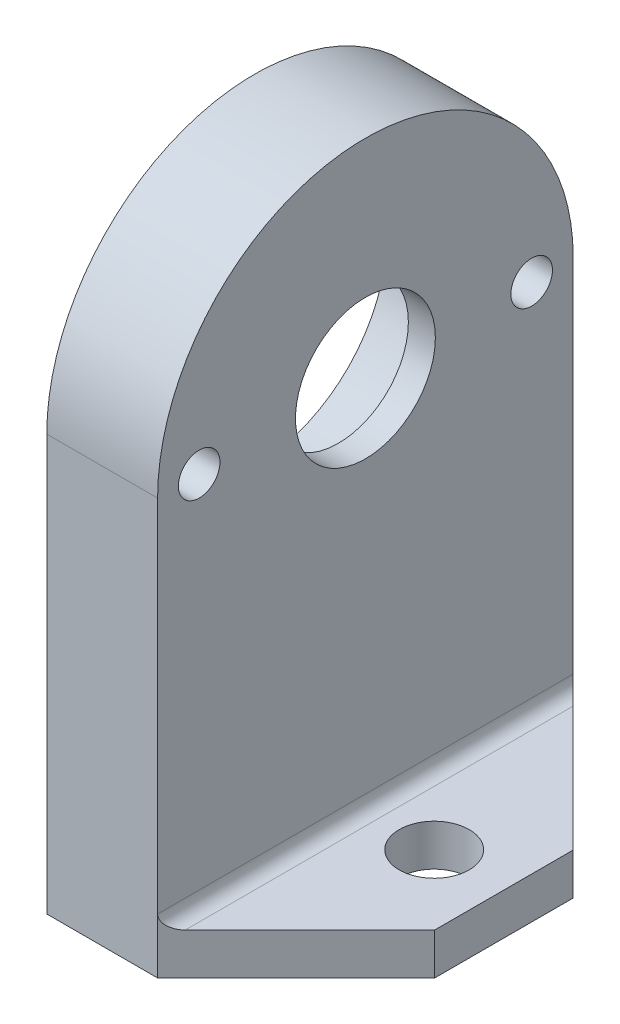
ISO-10303-21;
HEADER;
FILE_DESCRIPTION(('STEP AP214'),'2;1');
FILE_NAME('part.step','',(''),(''),'','','');
FILE_SCHEMA(('AUTOMOTIVE_DESIGN { 1 0 10303 214 1 1 1 1 }'));
ENDSEC;
DATA;
#1=APPLICATION_CONTEXT('core data for automotive mechanical design processes');
#2=APPLICATION_PROTOCOL_DEFINITION('international standard','automotive_design',2000,#1);
#3=PRODUCT_CONTEXT('',#1,'mechanical');
#4=PRODUCT('Part','Part','',(#3));
#5=PRODUCT_RELATED_PRODUCT_CATEGORY('part','',(#4));
#6=PRODUCT_DEFINITION_FORMATION('','',#4);
#7=PRODUCT_DEFINITION_CONTEXT('part definition',#1,'design');
#8=PRODUCT_DEFINITION('design','',#6,#7);
#9=PRODUCT_DEFINITION_SHAPE('','',#8);
#10=(LENGTH_UNIT() NAMED_UNIT(*) SI_UNIT(.MILLI.,.METRE.));
#11=(NAMED_UNIT(*) PLANE_ANGLE_UNIT() SI_UNIT($,.RADIAN.));
#12=(NAMED_UNIT(*) SI_UNIT($,.STERADIAN.) SOLID_ANGLE_UNIT());
#13=UNCERTAINTY_MEASURE_WITH_UNIT(LENGTH_MEASURE(1.E-05),#10,'distance_accuracy_value','');
#14=(GEOMETRIC_REPRESENTATION_CONTEXT(3) GLOBAL_UNCERTAINTY_ASSIGNED_CONTEXT((#13)) GLOBAL_UNIT_ASSIGNED_CONTEXT((#10,
#11,#12)) REPRESENTATION_CONTEXT('',''));
#15=CARTESIAN_POINT('',(0.,0.,0.));
#16=DIRECTION('',(0.,0.,1.));
#17=DIRECTION('',(1.,0.,0.));
#18=AXIS2_PLACEMENT_3D('',#15,#16,#17);
#19=CARTESIAN_POINT('',(4.,0.,0.));
#20=DIRECTION('',(1.,0.,0.));
#21=DIRECTION('',(0.,0.,-1.));
#22=AXIS2_PLACEMENT_3D('',#19,#20,#21);
#23=PLANE('',#22);
#24=CARTESIAN_POINT('',(4.,30.,12.));
#25=DIRECTION('',(1.,0.,0.));
#26=DIRECTION('',(0.,0.,-1.));
#27=AXIS2_PLACEMENT_3D('',#24,#25,#26);
#28=CIRCLE('',#27,1.5);
#29=CARTESIAN_POINT('',(4.,30.,10.5));
#30=VERTEX_POINT('',#29);
#31=EDGE_CURVE('E150',#30,#30,#28,.T.);
#32=ORIENTED_EDGE('',*,*,#31,.F.);
#33=EDGE_LOOP('',(#32));
#34=FACE_BOUND('',#33,.T.);
#35=CARTESIAN_POINT('',(4.,30.,-12.));
#36=DIRECTION('',(1.,0.,0.));
#37=DIRECTION('',(0.,0.,-1.));
#38=AXIS2_PLACEMENT_3D('',#35,#36,#37);
#39=CIRCLE('',#38,1.5);
#40=CARTESIAN_POINT('',(4.,30.,-13.5));
#41=VERTEX_POINT('',#40);
#42=EDGE_CURVE('E146',#41,#41,#39,.T.);
#43=ORIENTED_EDGE('',*,*,#42,.F.);
#44=EDGE_LOOP('',(#43));
#45=FACE_BOUND('',#44,.T.);
#46=CARTESIAN_POINT('',(4.,30.,0.));
#47=DIRECTION('',(1.,0.,0.));
#48=DIRECTION('',(0.,0.,-1.));
#49=AXIS2_PLACEMENT_3D('',#46,#47,#48);
#50=CIRCLE('',#49,5.05);
#51=CARTESIAN_POINT('',(4.,30.,-5.05));
#52=VERTEX_POINT('',#51);
#53=EDGE_CURVE('E244',#52,#52,#50,.T.);
#54=ORIENTED_EDGE('',*,*,#53,.F.);
#55=EDGE_LOOP('',(#54));
#56=FACE_BOUND('',#55,.T.);
#57=DIRECTION('',(0.,1.,0.));
#58=VECTOR('',#57,1.);
#59=CARTESIAN_POINT('',(4.,0.,15.));
#60=LINE('',#59,#58);
#61=CARTESIAN_POINT('',(4.,4.,15.));
#62=VERTEX_POINT('',#61);
#63=CARTESIAN_POINT('',(4.,30.,15.));
#64=VERTEX_POINT('',#63);
#65=EDGE_CURVE('E121',#62,#64,#60,.T.);
#66=ORIENTED_EDGE('',*,*,#65,.F.);
#67=DIRECTION('',(0.,0.,-1.));
#68=VECTOR('',#67,1.);
#69=CARTESIAN_POINT('',(4.,4.,0.));
#70=LINE('',#69,#68);
#71=CARTESIAN_POINT('',(4.00000000000001,4.,-15.));
#72=VERTEX_POINT('',#71);
#73=EDGE_CURVE('E218',#62,#72,#70,.T.);
#74=ORIENTED_EDGE('',*,*,#73,.T.);
#75=DIRECTION('',(0.,-1.,0.));
#76=VECTOR('',#75,1.);
#77=CARTESIAN_POINT('',(4.,0.,-15.));
#78=LINE('',#77,#76);
#79=CARTESIAN_POINT('',(4.,30.,-15.));
#80=VERTEX_POINT('',#79);
#81=EDGE_CURVE('E131',#80,#72,#78,.T.);
#82=ORIENTED_EDGE('',*,*,#81,.F.);
#83=CARTESIAN_POINT('',(4.,30.,0.));
#84=DIRECTION('',(1.,0.,0.));
#85=DIRECTION('',(0.,0.,-1.));
#86=AXIS2_PLACEMENT_3D('',#83,#84,#85);
#87=CIRCLE('',#86,15.);
#88=EDGE_CURVE('E132',#64,#80,#87,.F.);
#89=ORIENTED_EDGE('',*,*,#88,.F.);
#90=EDGE_LOOP('',(#66,#74,#82,#89));
#91=FACE_BOUND('',#90,.T.);
#92=ADVANCED_FACE('F49',(#34,#45,#56,#91),#23,.T.);
#93=CARTESIAN_POINT('',(4.,30.,0.));
#94=DIRECTION('',(-1.,0.,0.));
#95=DIRECTION('',(0.,0.,1.));
#96=AXIS2_PLACEMENT_3D('',#93,#94,#95);
#97=CYLINDRICAL_SURFACE('',#96,9.525);
#98=CARTESIAN_POINT('',(-4.,30.,0.));
#99=DIRECTION('',(1.,0.,0.));
#100=DIRECTION('',(0.,0.,-1.));
#101=AXIS2_PLACEMENT_3D('',#98,#99,#100);
#102=CIRCLE('',#101,9.525);
#103=CARTESIAN_POINT('',(-4.,30.,-9.525));
#104=VERTEX_POINT('',#103);
#105=EDGE_CURVE('E166',#104,#104,#102,.T.);
#106=ORIENTED_EDGE('',*,*,#105,.F.);
#107=EDGE_LOOP('',(#106));
#108=FACE_BOUND('',#107,.T.);
#109=CARTESIAN_POINT('',(2.05,30.,0.));
#110=DIRECTION('',(1.,0.,0.));
#111=DIRECTION('',(0.,0.,-1.));
#112=AXIS2_PLACEMENT_3D('',#109,#110,#111);
#113=CIRCLE('',#112,9.525);
#114=CARTESIAN_POINT('',(2.05,30.,-9.525));
#115=VERTEX_POINT('',#114);
#116=EDGE_CURVE('E162',#115,#115,#113,.T.);
#117=ORIENTED_EDGE('',*,*,#116,.T.);
#118=EDGE_LOOP('',(#117));
#119=FACE_BOUND('',#118,.T.);
#120=ADVANCED_FACE('F266',(#108,#119),#97,.F.);
#121=CARTESIAN_POINT('',(4.,30.,0.));
#122=DIRECTION('',(-1.,0.,0.));
#123=DIRECTION('',(0.,0.,1.));
#124=AXIS2_PLACEMENT_3D('',#121,#122,#123);
#125=CYLINDRICAL_SURFACE('',#124,15.);
#126=CARTESIAN_POINT('',(-4.,30.,0.));
#127=DIRECTION('',(1.,0.,0.));
#128=DIRECTION('',(0.,0.,-1.));
#129=AXIS2_PLACEMENT_3D('',#126,#127,#128);
#130=CIRCLE('',#129,15.);
#131=CARTESIAN_POINT('',(-4.,30.,15.));
#132=VERTEX_POINT('',#131);
#133=CARTESIAN_POINT('',(-4.,30.,-15.));
#134=VERTEX_POINT('',#133);
#135=EDGE_CURVE('E139',#132,#134,#130,.F.);
#136=ORIENTED_EDGE('',*,*,#135,.F.);
#137=DIRECTION('',(-1.,0.,0.));
#138=VECTOR('',#137,1.);
#139=CARTESIAN_POINT('',(4.,30.,15.));
#140=LINE('',#139,#138);
#141=EDGE_CURVE('E125',#64,#132,#140,.T.);
#142=ORIENTED_EDGE('',*,*,#141,.F.);
#143=ORIENTED_EDGE('',*,*,#88,.T.);
#144=DIRECTION('',(-1.,0.,0.));
#145=VECTOR('',#144,1.);
#146=CARTESIAN_POINT('',(4.,30.,-15.));
#147=LINE('',#146,#145);
#148=EDGE_CURVE('E156',#80,#134,#147,.T.);
#149=ORIENTED_EDGE('',*,*,#148,.T.);
#150=EDGE_LOOP('',(#136,#142,#143,#149));
#151=FACE_BOUND('',#150,.T.);
#152=ADVANCED_FACE('F136',(#151),#125,.T.);
#153=CARTESIAN_POINT('',(4.,0.,15.));
#154=DIRECTION('',(0.,0.,1.));
#155=DIRECTION('',(1.,0.,0.));
#156=AXIS2_PLACEMENT_3D('',#153,#154,#155);
#157=PLANE('',#156);
#158=DIRECTION('',(-1.,0.,0.));
#159=VECTOR('',#158,1.);
#160=CARTESIAN_POINT('',(4.,0.,15.));
#161=LINE('',#160,#159);
#162=CARTESIAN_POINT('',(3.99999999999996,0.,15.));
#163=VERTEX_POINT('',#162);
#164=CARTESIAN_POINT('',(-4.,0.,15.));
#165=VERTEX_POINT('',#164);
#166=EDGE_CURVE('E142',#163,#165,#161,.T.);
#167=ORIENTED_EDGE('',*,*,#166,.F.);
#168=DIRECTION('',(0.,1.,0.));
#169=VECTOR('',#168,1.);
#170=CARTESIAN_POINT('',(3.99999999999996,0.,15.));
#171=LINE('',#170,#169);
#172=EDGE_CURVE('E65',#163,#62,#171,.T.);
#173=ORIENTED_EDGE('',*,*,#172,.T.);
#174=ORIENTED_EDGE('',*,*,#65,.T.);
#175=ORIENTED_EDGE('',*,*,#141,.T.);
#176=DIRECTION('',(0.,1.,0.));
#177=VECTOR('',#176,1.);
#178=CARTESIAN_POINT('',(-4.,0.,15.));
#179=LINE('',#178,#177);
#180=EDGE_CURVE('E172',#165,#132,#179,.T.);
#181=ORIENTED_EDGE('',*,*,#180,.F.);
#182=EDGE_LOOP('',(#167,#173,#174,#175,#181));
#183=FACE_BOUND('',#182,.T.);
#184=ADVANCED_FACE('F123',(#183),#157,.T.);
#185=CARTESIAN_POINT('',(4.,0.,0.));
#186=DIRECTION('',(0.,-1.,0.));
#187=DIRECTION('',(0.,0.,-1.));
#188=AXIS2_PLACEMENT_3D('',#185,#186,#187);
#189=PLANE('',#188);
#190=CARTESIAN_POINT('',(8.96418123319642,0.,0.));
#191=DIRECTION('',(0.,-1.,0.));
#192=DIRECTION('',(0.,0.,-1.));
#193=AXIS2_PLACEMENT_3D('',#190,#191,#192);
#194=CIRCLE('',#193,2.52499999999999);
#195=CARTESIAN_POINT('',(8.96418123319642,0.,-2.525));
#196=VERTEX_POINT('',#195);
#197=EDGE_CURVE('E195',#196,#196,#194,.T.);
#198=ORIENTED_EDGE('',*,*,#197,.F.);
#199=EDGE_LOOP('',(#198));
#200=FACE_BOUND('',#199,.T.);
#201=DIRECTION('',(-1.,0.,0.));
#202=VECTOR('',#201,1.);
#203=CARTESIAN_POINT('',(4.,0.,-15.));
#204=LINE('',#203,#202);
#205=CARTESIAN_POINT('',(4.00000000000001,0.,-15.));
#206=VERTEX_POINT('',#205);
#207=CARTESIAN_POINT('',(-4.,0.,-15.));
#208=VERTEX_POINT('',#207);
#209=EDGE_CURVE('E185',#206,#208,#204,.T.);
#210=ORIENTED_EDGE('',*,*,#209,.F.);
#211=DIRECTION('',(-0.707106781186546,0.,-0.707106781186549));
#212=VECTOR('',#211,1.);
#213=CARTESIAN_POINT('',(11.5,0.,-7.49999999999997));
#214=LINE('',#213,#212);
#215=CARTESIAN_POINT('',(14.,0.,-4.99999999999995));
#216=VERTEX_POINT('',#215);
#217=EDGE_CURVE('E201',#206,#216,#214,.F.);
#218=ORIENTED_EDGE('',*,*,#217,.T.);
#219=DIRECTION('',(0.,0.,1.));
#220=VECTOR('',#219,1.);
#221=CARTESIAN_POINT('',(14.,0.,15.));
#222=LINE('',#221,#220);
#223=CARTESIAN_POINT('',(14.,0.,5.00000000000001));
#224=VERTEX_POINT('',#223);
#225=EDGE_CURVE('E194',#216,#224,#222,.T.);
#226=ORIENTED_EDGE('',*,*,#225,.T.);
#227=DIRECTION('',(0.707106781186549,0.,-0.707106781186546));
#228=VECTOR('',#227,1.);
#229=CARTESIAN_POINT('',(11.5,0.,7.50000000000002));
#230=LINE('',#229,#228);
#231=EDGE_CURVE('E198',#224,#163,#230,.F.);
#232=ORIENTED_EDGE('',*,*,#231,.T.);
#233=ORIENTED_EDGE('',*,*,#166,.T.);
#234=DIRECTION('',(0.,0.,1.));
#235=VECTOR('',#234,1.);
#236=CARTESIAN_POINT('',(-4.,0.,0.));
#237=LINE('',#236,#235);
#238=EDGE_CURVE('E175',#208,#165,#237,.T.);
#239=ORIENTED_EDGE('',*,*,#238,.F.);
#240=EDGE_LOOP('',(#210,#218,#226,#232,#233,#239));
#241=FACE_BOUND('',#240,.T.);
#242=ADVANCED_FACE('F240',(#200,#241),#189,.T.);
#243=CARTESIAN_POINT('',(4.,30.,-12.));
#244=DIRECTION('',(-1.,0.,0.));
#245=DIRECTION('',(0.,0.,1.));
#246=AXIS2_PLACEMENT_3D('',#243,#244,#245);
#247=CYLINDRICAL_SURFACE('',#246,1.5);
#248=ORIENTED_EDGE('',*,*,#42,.T.);
#249=EDGE_LOOP('',(#248));
#250=FACE_BOUND('',#249,.T.);
#251=CARTESIAN_POINT('',(-4.,30.,-12.));
#252=DIRECTION('',(1.,0.,0.));
#253=DIRECTION('',(0.,0.,-1.));
#254=AXIS2_PLACEMENT_3D('',#251,#252,#253);
#255=CIRCLE('',#254,1.5);
#256=CARTESIAN_POINT('',(-4.,30.,-13.5));
#257=VERTEX_POINT('',#256);
#258=EDGE_CURVE('E161',#257,#257,#255,.T.);
#259=ORIENTED_EDGE('',*,*,#258,.F.);
#260=EDGE_LOOP('',(#259));
#261=FACE_BOUND('',#260,.T.);
#262=ADVANCED_FACE('F297',(#250,#261),#247,.F.);
#263=CARTESIAN_POINT('',(4.,30.,12.));
#264=DIRECTION('',(-1.,0.,0.));
#265=DIRECTION('',(0.,0.,1.));
#266=AXIS2_PLACEMENT_3D('',#263,#264,#265);
#267=CYLINDRICAL_SURFACE('',#266,1.5);
#268=ORIENTED_EDGE('',*,*,#31,.T.);
#269=EDGE_LOOP('',(#268));
#270=FACE_BOUND('',#269,.T.);
#271=CARTESIAN_POINT('',(-4.,30.,12.));
#272=DIRECTION('',(1.,0.,0.));
#273=DIRECTION('',(0.,0.,-1.));
#274=AXIS2_PLACEMENT_3D('',#271,#272,#273);
#275=CIRCLE('',#274,1.5);
#276=CARTESIAN_POINT('',(-4.,30.,10.5));
#277=VERTEX_POINT('',#276);
#278=EDGE_CURVE('E157',#277,#277,#275,.T.);
#279=ORIENTED_EDGE('',*,*,#278,.F.);
#280=EDGE_LOOP('',(#279));
#281=FACE_BOUND('',#280,.T.);
#282=ADVANCED_FACE('F261',(#270,#281),#267,.F.);
#283=CARTESIAN_POINT('',(4.,0.,-15.));
#284=DIRECTION('',(0.,0.,-1.));
#285=DIRECTION('',(0.,1.,0.));
#286=AXIS2_PLACEMENT_3D('',#283,#284,#285);
#287=PLANE('',#286);
#288=ORIENTED_EDGE('',*,*,#81,.T.);
#289=DIRECTION('',(0.,-1.,0.));
#290=VECTOR('',#289,1.);
#291=CARTESIAN_POINT('',(4.00000000000001,0.,-15.));
#292=LINE('',#291,#290);
#293=EDGE_CURVE('E85',#72,#206,#292,.T.);
#294=ORIENTED_EDGE('',*,*,#293,.T.);
#295=ORIENTED_EDGE('',*,*,#209,.T.);
#296=DIRECTION('',(0.,-1.,0.));
#297=VECTOR('',#296,1.);
#298=CARTESIAN_POINT('',(-4.,0.,-15.));
#299=LINE('',#298,#297);
#300=EDGE_CURVE('E179',#134,#208,#299,.T.);
#301=ORIENTED_EDGE('',*,*,#300,.F.);
#302=ORIENTED_EDGE('',*,*,#148,.F.);
#303=EDGE_LOOP('',(#288,#294,#295,#301,#302));
#304=FACE_BOUND('',#303,.T.);
#305=ADVANCED_FACE('F290',(#304),#287,.T.);
#306=CARTESIAN_POINT('',(-4.,0.,0.));
#307=DIRECTION('',(1.,0.,0.));
#308=DIRECTION('',(0.,0.,-1.));
#309=AXIS2_PLACEMENT_3D('',#306,#307,#308);
#310=PLANE('',#309);
#311=ORIENTED_EDGE('',*,*,#278,.T.);
#312=EDGE_LOOP('',(#311));
#313=FACE_BOUND('',#312,.T.);
#314=ORIENTED_EDGE('',*,*,#258,.T.);
#315=EDGE_LOOP('',(#314));
#316=FACE_BOUND('',#315,.T.);
#317=ORIENTED_EDGE('',*,*,#105,.T.);
#318=EDGE_LOOP('',(#317));
#319=FACE_BOUND('',#318,.T.);
#320=ORIENTED_EDGE('',*,*,#135,.T.);
#321=ORIENTED_EDGE('',*,*,#300,.T.);
#322=ORIENTED_EDGE('',*,*,#238,.T.);
#323=ORIENTED_EDGE('',*,*,#180,.T.);
#324=EDGE_LOOP('',(#320,#321,#322,#323));
#325=FACE_BOUND('',#324,.T.);
#326=ADVANCED_FACE('F282',(#313,#316,#319,#325),#310,.F.);
#327=CARTESIAN_POINT('',(2.05,30.,0.));
#328=DIRECTION('',(1.,0.,0.));
#329=DIRECTION('',(0.,0.,-1.));
#330=AXIS2_PLACEMENT_3D('',#327,#328,#329);
#331=PLANE('',#330);
#332=CARTESIAN_POINT('',(2.05,30.,0.));
#333=DIRECTION('',(1.,0.,0.));
#334=DIRECTION('',(0.,0.,-1.));
#335=AXIS2_PLACEMENT_3D('',#332,#333,#334);
#336=CIRCLE('',#335,5.05);
#337=CARTESIAN_POINT('',(2.05,30.,-5.05));
#338=VERTEX_POINT('',#337);
#339=EDGE_CURVE('E248',#338,#338,#336,.T.);
#340=ORIENTED_EDGE('',*,*,#339,.T.);
#341=EDGE_LOOP('',(#340));
#342=FACE_BOUND('',#341,.T.);
#343=ORIENTED_EDGE('',*,*,#116,.F.);
#344=EDGE_LOOP('',(#343));
#345=FACE_BOUND('',#344,.T.);
#346=ADVANCED_FACE('F274',(#342,#345),#331,.F.);
#347=CARTESIAN_POINT('',(2.05,30.,0.));
#348=DIRECTION('',(1.,0.,0.));
#349=DIRECTION('',(0.,0.,-1.));
#350=AXIS2_PLACEMENT_3D('',#347,#348,#349);
#351=CYLINDRICAL_SURFACE('',#350,5.05);
#352=ORIENTED_EDGE('',*,*,#339,.F.);
#353=EDGE_LOOP('',(#352));
#354=FACE_BOUND('',#353,.T.);
#355=ORIENTED_EDGE('',*,*,#53,.T.);
#356=EDGE_LOOP('',(#355));
#357=FACE_BOUND('',#356,.T.);
#358=ADVANCED_FACE('F272',(#354,#357),#351,.F.);
#359=CARTESIAN_POINT('',(14.,3.,15.));
#360=DIRECTION('',(1.,0.,0.));
#361=DIRECTION('',(0.,0.,-1.));
#362=AXIS2_PLACEMENT_3D('',#359,#360,#361);
#363=PLANE('',#362);
#364=ORIENTED_EDGE('',*,*,#225,.F.);
#365=DIRECTION('',(0.,1.,0.));
#366=VECTOR('',#365,1.);
#367=CARTESIAN_POINT('',(14.,3.,-4.99999999999996));
#368=LINE('',#367,#366);
#369=CARTESIAN_POINT('',(14.,3.,-4.99999999999995));
#370=VERTEX_POINT('',#369);
#371=EDGE_CURVE('E208',#216,#370,#368,.T.);
#372=ORIENTED_EDGE('',*,*,#371,.T.);
#373=DIRECTION('',(0.,0.,1.));
#374=VECTOR('',#373,1.);
#375=CARTESIAN_POINT('',(14.,3.,15.));
#376=LINE('',#375,#374);
#377=CARTESIAN_POINT('',(14.,3.,5.00000000000001));
#378=VERTEX_POINT('',#377);
#379=EDGE_CURVE('E229',#370,#378,#376,.T.);
#380=ORIENTED_EDGE('',*,*,#379,.T.);
#381=DIRECTION('',(0.,-1.,0.));
#382=VECTOR('',#381,1.);
#383=CARTESIAN_POINT('',(14.,3.,5.00000000000001));
#384=LINE('',#383,#382);
#385=EDGE_CURVE('E204',#378,#224,#384,.T.);
#386=ORIENTED_EDGE('',*,*,#385,.T.);
#387=EDGE_LOOP('',(#364,#372,#380,#386));
#388=FACE_BOUND('',#387,.T.);
#389=ADVANCED_FACE('F237',(#388),#363,.T.);
#390=CARTESIAN_POINT('',(0.,3.,0.));
#391=DIRECTION('',(0.,-1.,0.));
#392=DIRECTION('',(0.,0.,-1.));
#393=AXIS2_PLACEMENT_3D('',#390,#391,#392);
#394=PLANE('',#393);
#395=CARTESIAN_POINT('',(8.96418123319642,3.,0.));
#396=DIRECTION('',(0.,-1.,0.));
#397=DIRECTION('',(0.,0.,-1.));
#398=AXIS2_PLACEMENT_3D('',#395,#396,#397);
#399=CIRCLE('',#398,2.52499999999999);
#400=CARTESIAN_POINT('',(8.96418123319642,3.00000000000001,-2.525));
#401=VERTEX_POINT('',#400);
#402=EDGE_CURVE('E190',#401,#401,#399,.T.);
#403=ORIENTED_EDGE('',*,*,#402,.T.);
#404=EDGE_LOOP('',(#403));
#405=FACE_BOUND('',#404,.T.);
#406=DIRECTION('',(0.707106781186546,0.,0.707106781186549));
#407=VECTOR('',#406,1.);
#408=CARTESIAN_POINT('',(4.00000000000001,3.,-15.));
#409=LINE('',#408,#407);
#410=CARTESIAN_POINT('',(5.,3.,-14.));
#411=VERTEX_POINT('',#410);
#412=EDGE_CURVE('E213',#370,#411,#409,.F.);
#413=ORIENTED_EDGE('',*,*,#412,.T.);
#414=DIRECTION('',(0.,0.,-1.));
#415=VECTOR('',#414,1.);
#416=CARTESIAN_POINT('',(5.,3.,0.));
#417=LINE('',#416,#415);
#418=CARTESIAN_POINT('',(5.,3.,14.));
#419=VERTEX_POINT('',#418);
#420=EDGE_CURVE('E74',#411,#419,#417,.F.);
#421=ORIENTED_EDGE('',*,*,#420,.T.);
#422=DIRECTION('',(-0.707106781186549,0.,0.707106781186546));
#423=VECTOR('',#422,1.);
#424=CARTESIAN_POINT('',(14.,3.,5.00000000000001));
#425=LINE('',#424,#423);
#426=EDGE_CURVE('E89',#419,#378,#425,.F.);
#427=ORIENTED_EDGE('',*,*,#426,.T.);
#428=ORIENTED_EDGE('',*,*,#379,.F.);
#429=EDGE_LOOP('',(#413,#421,#427,#428));
#430=FACE_BOUND('',#429,.T.);
#431=ADVANCED_FACE('F228',(#405,#430),#394,.F.);
#432=CARTESIAN_POINT('',(8.96418123319642,45.,0.));
#433=DIRECTION('',(0.,-1.,0.));
#434=DIRECTION('',(0.,0.,-1.));
#435=AXIS2_PLACEMENT_3D('',#432,#433,#434);
#436=CYLINDRICAL_SURFACE('',#435,2.52499999999999);
#437=CARTESIAN_POINT('',(8.96418123319642,0.,-2.525));
#438=CARTESIAN_POINT('',(8.96418123319642,0.0312500000000081,-2.525));
#439=CARTESIAN_POINT('',(8.96418123319642,0.0625000000000093,-2.525));
#440=CARTESIAN_POINT('',(8.96418123319642,0.125000000000009,-2.525));
#441=CARTESIAN_POINT('',(8.96418123319642,0.156250000000008,-2.525));
#442=CARTESIAN_POINT('',(8.96418123319642,0.218750000000006,-2.525));
#443=CARTESIAN_POINT('',(8.96418123319642,0.250000000000005,-2.525));
#444=CARTESIAN_POINT('',(8.96418123319642,0.312500000000005,-2.525));
#445=CARTESIAN_POINT('',(8.96418123319642,0.343750000000006,-2.525));
#446=CARTESIAN_POINT('',(8.96418123319642,0.406250000000008,-2.525));
#447=CARTESIAN_POINT('',(8.96418123319642,0.43750000000001,-2.525));
#448=CARTESIAN_POINT('',(8.96418123319642,0.50000000000001,-2.525));
#449=CARTESIAN_POINT('',(8.96418123319642,0.531250000000009,-2.525));
#450=CARTESIAN_POINT('',(8.96418123319642,0.593750000000006,-2.525));
#451=CARTESIAN_POINT('',(8.96418123319642,0.625000000000005,-2.525));
#452=CARTESIAN_POINT('',(8.96418123319642,0.687500000000005,-2.525));
#453=CARTESIAN_POINT('',(8.96418123319642,0.718750000000006,-2.525));
#454=CARTESIAN_POINT('',(8.96418123319642,0.781250000000009,-2.525));
#455=CARTESIAN_POINT('',(8.96418123319642,0.81250000000001,-2.525));
#456=CARTESIAN_POINT('',(8.96418123319642,0.87500000000001,-2.525));
#457=CARTESIAN_POINT('',(8.96418123319642,0.906250000000009,-2.525));
#458=CARTESIAN_POINT('',(8.96418123319642,0.968750000000007,-2.525));
#459=CARTESIAN_POINT('',(8.96418123319642,1.00000000000001,-2.525));
#460=CARTESIAN_POINT('',(8.96418123319642,1.06250000000001,-2.525));
#461=CARTESIAN_POINT('',(8.96418123319642,1.09375000000001,-2.525));
#462=CARTESIAN_POINT('',(8.96418123319642,1.15625000000001,-2.525));
#463=CARTESIAN_POINT('',(8.96418123319642,1.18750000000001,-2.525));
#464=CARTESIAN_POINT('',(8.96418123319642,1.25000000000001,-2.525));
#465=CARTESIAN_POINT('',(8.96418123319642,1.28125000000001,-2.525));
#466=CARTESIAN_POINT('',(8.96418123319642,1.34375000000001,-2.525));
#467=CARTESIAN_POINT('',(8.96418123319642,1.37500000000001,-2.525));
#468=CARTESIAN_POINT('',(8.96418123319642,1.43750000000001,-2.525));
#469=CARTESIAN_POINT('',(8.96418123319642,1.46875000000001,-2.525));
#470=CARTESIAN_POINT('',(8.96418123319642,1.53125000000001,-2.525));
#471=CARTESIAN_POINT('',(8.96418123319642,1.56250000000001,-2.525));
#472=CARTESIAN_POINT('',(8.96418123319642,1.62500000000001,-2.525));
#473=CARTESIAN_POINT('',(8.96418123319642,1.65625000000001,-2.525));
#474=CARTESIAN_POINT('',(8.96418123319642,1.71875000000001,-2.525));
#475=CARTESIAN_POINT('',(8.96418123319642,1.75000000000001,-2.525));
#476=CARTESIAN_POINT('',(8.96418123319642,1.81250000000001,-2.525));
#477=CARTESIAN_POINT('',(8.96418123319642,1.84375000000001,-2.525));
#478=CARTESIAN_POINT('',(8.96418123319642,1.90625000000001,-2.525));
#479=CARTESIAN_POINT('',(8.96418123319642,1.93750000000001,-2.525));
#480=CARTESIAN_POINT('',(8.96418123319642,2.00000000000001,-2.525));
#481=CARTESIAN_POINT('',(8.96418123319642,2.03125000000001,-2.525));
#482=CARTESIAN_POINT('',(8.96418123319642,2.09375000000001,-2.525));
#483=CARTESIAN_POINT('',(8.96418123319642,2.12500000000001,-2.525));
#484=CARTESIAN_POINT('',(8.96418123319642,2.18750000000001,-2.525));
#485=CARTESIAN_POINT('',(8.96418123319642,2.21875000000001,-2.525));
#486=CARTESIAN_POINT('',(8.96418123319642,2.28125000000001,-2.525));
#487=CARTESIAN_POINT('',(8.96418123319642,2.31250000000001,-2.525));
#488=CARTESIAN_POINT('',(8.96418123319642,2.37500000000001,-2.525));
#489=CARTESIAN_POINT('',(8.96418123319642,2.40625000000001,-2.525));
#490=CARTESIAN_POINT('',(8.96418123319642,2.46875000000001,-2.525));
#491=CARTESIAN_POINT('',(8.96418123319642,2.50000000000001,-2.525));
#492=CARTESIAN_POINT('',(8.96418123319642,2.56250000000001,-2.525));
#493=CARTESIAN_POINT('',(8.96418123319642,2.59375000000001,-2.525));
#494=CARTESIAN_POINT('',(8.96418123319642,2.65625000000001,-2.525));
#495=CARTESIAN_POINT('',(8.96418123319642,2.68750000000001,-2.525));
#496=CARTESIAN_POINT('',(8.96418123319642,2.75000000000001,-2.525));
#497=CARTESIAN_POINT('',(8.96418123319642,2.78125000000001,-2.525));
#498=CARTESIAN_POINT('',(8.96418123319642,2.84375000000001,-2.525));
#499=CARTESIAN_POINT('',(8.96418123319642,2.87500000000001,-2.525));
#500=CARTESIAN_POINT('',(8.96418123319642,2.93750000000001,-2.525));
#501=CARTESIAN_POINT('',(8.96418123319642,2.96875000000001,-2.525));
#502=CARTESIAN_POINT('',(8.96418123319642,3.00000000000001,-2.525));
#503=B_SPLINE_CURVE_WITH_KNOTS('',3,(#437,#438,#439,#440,#441,#442,#443,#444,#445,#446,#447,
#448,#449,#450,#451,#452,#453,#454,#455,#456,#457,#458,#459,#460,#461,#462,#463,#464,#465,#466,
#467,#468,#469,#470,#471,#472,#473,#474,#475,#476,#477,#478,#479,#480,#481,#482,#483,#484,#485,
#486,#487,#488,#489,#490,#491,#492,#493,#494,#495,#496,#497,#498,#499,#500,#501,#502),
.UNSPECIFIED.,.F.,.F.,(4,2,2,2,2,2,2,2,2,2,2,2,2,2,2,2,2,2,2,2,2,2,2,2,2,2,2,2,2,2,2,2,4),(0.,
0.0937500000000036,0.1875,0.281249999999997,0.375,0.468750000000004,0.5625,0.656249999999997,
0.750000000000001,0.843750000000004,0.937500000000001,1.03125,1.125,1.21875,1.3125,1.40625,1.5,
1.59375,1.6875,1.78125,1.875,1.96875000000001,2.0625,2.15625,2.25,2.34375000000001,2.4375,
2.53125,2.625,2.71875000000001,2.8125,2.90625,3.),.UNSPECIFIED.);
#504=EDGE_CURVE('BSEAM312',#196,#401,#503,.T.);
#505=ORIENTED_EDGE('',*,*,#197,.T.);
#506=ORIENTED_EDGE('',*,*,#402,.F.);
#507=ORIENTED_EDGE('',*,*,#504,.T.);
#508=ORIENTED_EDGE('',*,*,#504,.F.);
#509=EDGE_LOOP('',(#505,#507,#506,#508));
#510=FACE_BOUND('',#509,.T.);
#511=ADVANCED_FACE('F312',(#510),#436,.F.);
#512=CARTESIAN_POINT('',(4.00000000000001,0.,-15.));
#513=DIRECTION('',(-0.707106781186549,0.,0.707106781186546));
#514=DIRECTION('',(0.,-1.,0.));
#515=AXIS2_PLACEMENT_3D('',#512,#513,#514);
#516=PLANE('',#515);
#517=ORIENTED_EDGE('',*,*,#412,.F.);
#518=ORIENTED_EDGE('',*,*,#371,.F.);
#519=ORIENTED_EDGE('',*,*,#217,.F.);
#520=ORIENTED_EDGE('',*,*,#293,.F.);
#521=CARTESIAN_POINT('',(5.,4.,-14.));
#522=DIRECTION('',(-0.707106781186549,0.,0.707106781186546));
#523=DIRECTION('',(-0.707106781186546,0.,-0.707106781186549));
#524=AXIS2_PLACEMENT_3D('',#521,#522,#523);
#525=ELLIPSE('',#524,1.4142135623731,1.);
#526=EDGE_CURVE('E58',#72,#411,#525,.T.);
#527=ORIENTED_EDGE('',*,*,#526,.T.);
#528=EDGE_LOOP('',(#517,#518,#519,#520,#527));
#529=FACE_BOUND('',#528,.T.);
#530=ADVANCED_FACE('F224',(#529),#516,.F.);
#531=CARTESIAN_POINT('',(14.,3.,5.00000000000001));
#532=DIRECTION('',(-0.707106781186546,0.,-0.707106781186549));
#533=DIRECTION('',(0.,-1.,0.));
#534=AXIS2_PLACEMENT_3D('',#531,#532,#533);
#535=PLANE('',#534);
#536=ORIENTED_EDGE('',*,*,#426,.F.);
#537=CARTESIAN_POINT('',(5.,4.,14.));
#538=DIRECTION('',(-0.707106781186546,0.,-0.707106781186549));
#539=DIRECTION('',(0.707106781186549,0.,-0.707106781186546));
#540=AXIS2_PLACEMENT_3D('',#537,#538,#539);
#541=ELLIPSE('',#540,1.41421356237309,1.);
#542=EDGE_CURVE('E12',#419,#62,#541,.T.);
#543=ORIENTED_EDGE('',*,*,#542,.T.);
#544=ORIENTED_EDGE('',*,*,#172,.F.);
#545=ORIENTED_EDGE('',*,*,#231,.F.);
#546=ORIENTED_EDGE('',*,*,#385,.F.);
#547=EDGE_LOOP('',(#536,#543,#544,#545,#546));
#548=FACE_BOUND('',#547,.T.);
#549=ADVANCED_FACE('F232',(#548),#535,.F.);
#550=CARTESIAN_POINT('',(5.,4.,0.));
#551=DIRECTION('',(0.,0.,-1.));
#552=DIRECTION('',(0.,1.,0.));
#553=AXIS2_PLACEMENT_3D('',#550,#551,#552);
#554=CYLINDRICAL_SURFACE('',#553,1.);
#555=ORIENTED_EDGE('',*,*,#542,.F.);
#556=ORIENTED_EDGE('',*,*,#420,.F.);
#557=ORIENTED_EDGE('',*,*,#526,.F.);
#558=ORIENTED_EDGE('',*,*,#73,.F.);
#559=EDGE_LOOP('',(#555,#556,#557,#558));
#560=FACE_BOUND('',#559,.T.);
#561=ADVANCED_FACE('F51',(#560),#554,.F.);
#562=CLOSED_SHELL('',(#92,#120,#152,#184,#242,#262,#282,#305,#326,#346,#358,#389,#431,#511,#530,
#549,#561));
#563=MANIFOLD_SOLID_BREP('B2',#562);
#564=ADVANCED_BREP_SHAPE_REPRESENTATION('',(#18,#563),#14);
#565=SHAPE_DEFINITION_REPRESENTATION(#9,#564);
ENDSEC;
END-ISO-10303-21;
